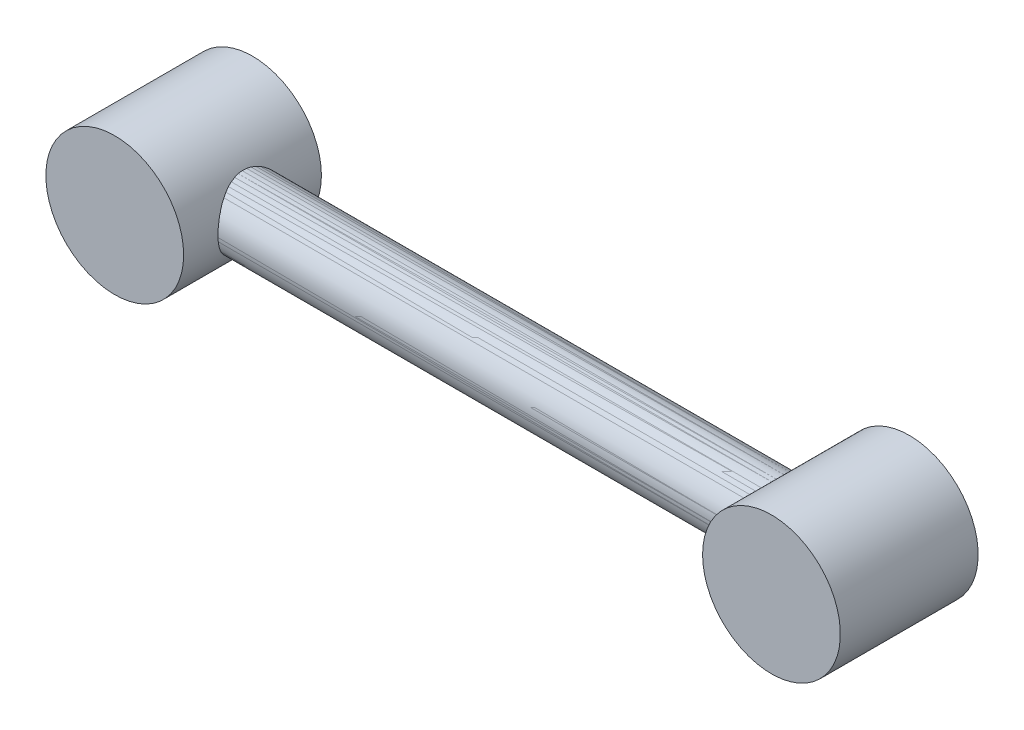
ISO-10303-21;
HEADER;
FILE_DESCRIPTION(('STEP AP214'),'2;1');
FILE_NAME('part.step','',(''),(''),'','','');
FILE_SCHEMA(('AUTOMOTIVE_DESIGN { 1 0 10303 214 1 1 1 1 }'));
ENDSEC;
DATA;
#1=APPLICATION_CONTEXT('core data for automotive mechanical design processes');
#2=APPLICATION_PROTOCOL_DEFINITION('international standard','automotive_design',2000,#1);
#3=PRODUCT_CONTEXT('',#1,'mechanical');
#4=PRODUCT('Part','Part','',(#3));
#5=PRODUCT_RELATED_PRODUCT_CATEGORY('part','',(#4));
#6=PRODUCT_DEFINITION_FORMATION('','',#4);
#7=PRODUCT_DEFINITION_CONTEXT('part definition',#1,'design');
#8=PRODUCT_DEFINITION('design','',#6,#7);
#9=PRODUCT_DEFINITION_SHAPE('','',#8);
#10=(LENGTH_UNIT() NAMED_UNIT(*) SI_UNIT(.MILLI.,.METRE.));
#11=(NAMED_UNIT(*) PLANE_ANGLE_UNIT() SI_UNIT($,.RADIAN.));
#12=(NAMED_UNIT(*) SI_UNIT($,.STERADIAN.) SOLID_ANGLE_UNIT());
#13=UNCERTAINTY_MEASURE_WITH_UNIT(LENGTH_MEASURE(1.E-05),#10,'distance_accuracy_value','');
#14=(GEOMETRIC_REPRESENTATION_CONTEXT(3) GLOBAL_UNCERTAINTY_ASSIGNED_CONTEXT((#13)) GLOBAL_UNIT_ASSIGNED_CONTEXT((#10,
#11,#12)) REPRESENTATION_CONTEXT('',''));
#15=CARTESIAN_POINT('',(0.,0.,0.));
#16=DIRECTION('',(0.,0.,1.));
#17=DIRECTION('',(1.,0.,0.));
#18=AXIS2_PLACEMENT_3D('',#15,#16,#17);
#19=CARTESIAN_POINT('',(87.6660349232078,0.,-10.));
#20=DIRECTION('',(0.,0.,1.));
#21=DIRECTION('',(-1.,0.,0.));
#22=AXIS2_PLACEMENT_3D('',#19,#20,#21);
#23=CYLINDRICAL_SURFACE('',#22,10.);
#24=CARTESIAN_POINT('',(87.6660349232078,0.,-10.));
#25=DIRECTION('',(0.,0.,-1.));
#26=DIRECTION('',(-1.,0.,0.));
#27=AXIS2_PLACEMENT_3D('',#24,#25,#26);
#28=CIRCLE('',#27,10.);
#29=CARTESIAN_POINT('',(77.6660349232078,0.,-10.));
#30=VERTEX_POINT('',#29);
#31=EDGE_CURVE('E11',#30,#30,#28,.T.);
#32=ORIENTED_EDGE('',*,*,#31,.F.);
#33=EDGE_LOOP('',(#32));
#34=FACE_BOUND('',#33,.T.);
#35=CARTESIAN_POINT('',(87.6660349232078,0.,10.));
#36=DIRECTION('',(0.,0.,-1.));
#37=DIRECTION('',(-1.,0.,0.));
#38=AXIS2_PLACEMENT_3D('',#35,#36,#37);
#39=CIRCLE('',#38,10.);
#40=CARTESIAN_POINT('',(77.6660349232078,0.,10.));
#41=VERTEX_POINT('',#40);
#42=EDGE_CURVE('E51',#41,#41,#39,.T.);
#43=ORIENTED_EDGE('',*,*,#42,.T.);
#44=EDGE_LOOP('',(#43));
#45=FACE_BOUND('',#44,.T.);
#46=ADVANCED_FACE('F45',(#34,#45),#23,.T.);
#47=CARTESIAN_POINT('',(87.6660349232078,0.,-10.));
#48=DIRECTION('',(0.,0.,1.));
#49=DIRECTION('',(-1.,0.,0.));
#50=AXIS2_PLACEMENT_3D('',#47,#48,#49);
#51=PLANE('',#50);
#52=ORIENTED_EDGE('',*,*,#31,.T.);
#53=EDGE_LOOP('',(#52));
#54=FACE_BOUND('',#53,.T.);
#55=ADVANCED_FACE('F60',(#54),#51,.F.);
#56=CARTESIAN_POINT('',(87.6660349232078,0.,10.));
#57=DIRECTION('',(0.,0.,1.));
#58=DIRECTION('',(-1.,0.,0.));
#59=AXIS2_PLACEMENT_3D('',#56,#57,#58);
#60=PLANE('',#59);
#61=ORIENTED_EDGE('',*,*,#42,.F.);
#62=EDGE_LOOP('',(#61));
#63=FACE_BOUND('',#62,.T.);
#64=ADVANCED_FACE('F58',(#63),#60,.T.);
#65=CLOSED_SHELL('',(#46,#55,#64));
#66=MANIFOLD_SOLID_BREP('B2',#65);
#67=CARTESIAN_POINT('',(0.,0.,0.));
#68=DIRECTION('',(1.,0.,0.));
#69=DIRECTION('',(0.,0.,1.));
#70=AXIS2_PLACEMENT_3D('',#67,#68,#69);
#71=CYLINDRICAL_SURFACE('',#70,5.);
#72=CARTESIAN_POINT('',(0.,0.,0.));
#73=DIRECTION('',(1.,0.,0.));
#74=DIRECTION('',(0.,0.,-1.));
#75=AXIS2_PLACEMENT_3D('',#72,#73,#74);
#76=CIRCLE('',#75,5.);
#77=CARTESIAN_POINT('',(0.,0.,-5.));
#78=VERTEX_POINT('',#77);
#79=EDGE_CURVE('E44',#78,#78,#76,.T.);
#80=ORIENTED_EDGE('',*,*,#79,.T.);
#81=EDGE_LOOP('',(#80));
#82=FACE_BOUND('',#81,.T.);
#83=CARTESIAN_POINT('',(80.,0.,0.));
#84=DIRECTION('',(1.,0.,0.));
#85=DIRECTION('',(0.,0.,-1.));
#86=AXIS2_PLACEMENT_3D('',#83,#84,#85);
#87=CIRCLE('',#86,5.);
#88=CARTESIAN_POINT('',(80.,0.,-5.));
#89=VERTEX_POINT('',#88);
#90=EDGE_CURVE('E102',#89,#89,#87,.T.);
#91=ORIENTED_EDGE('',*,*,#90,.F.);
#92=EDGE_LOOP('',(#91));
#93=FACE_BOUND('',#92,.T.);
#94=ADVANCED_FACE('F99',(#82,#93),#71,.T.);
#95=CARTESIAN_POINT('',(0.,0.,0.));
#96=DIRECTION('',(-1.,0.,0.));
#97=DIRECTION('',(0.,0.,-1.));
#98=AXIS2_PLACEMENT_3D('',#95,#96,#97);
#99=PLANE('',#98);
#100=ORIENTED_EDGE('',*,*,#79,.F.);
#101=EDGE_LOOP('',(#100));
#102=FACE_BOUND('',#101,.T.);
#103=ADVANCED_FACE('F114',(#102),#99,.T.);
#104=CARTESIAN_POINT('',(80.,0.,0.));
#105=DIRECTION('',(-1.,0.,0.));
#106=DIRECTION('',(0.,0.,-1.));
#107=AXIS2_PLACEMENT_3D('',#104,#105,#106);
#108=PLANE('',#107);
#109=ORIENTED_EDGE('',*,*,#90,.T.);
#110=EDGE_LOOP('',(#109));
#111=FACE_BOUND('',#110,.T.);
#112=ADVANCED_FACE('F111',(#111),#108,.F.);
#113=CLOSED_SHELL('',(#94,#103,#112));
#114=MANIFOLD_SOLID_BREP('B6',#113);
#115=CARTESIAN_POINT('',(-7.66603492320783,0.,-10.));
#116=DIRECTION('',(0.,0.,1.));
#117=DIRECTION('',(1.,0.,0.));
#118=AXIS2_PLACEMENT_3D('',#115,#116,#117);
#119=CYLINDRICAL_SURFACE('',#118,10.);
#120=CARTESIAN_POINT('',(-7.66603492320783,0.,-10.));
#121=DIRECTION('',(0.,0.,1.));
#122=DIRECTION('',(1.,0.,0.));
#123=AXIS2_PLACEMENT_3D('',#120,#121,#122);
#124=CIRCLE('',#123,10.);
#125=CARTESIAN_POINT('',(2.33396507679217,0.,-10.));
#126=VERTEX_POINT('',#125);
#127=EDGE_CURVE('E98',#126,#126,#124,.T.);
#128=ORIENTED_EDGE('',*,*,#127,.T.);
#129=EDGE_LOOP('',(#128));
#130=FACE_BOUND('',#129,.T.);
#131=CARTESIAN_POINT('',(-7.66603492320783,0.,10.));
#132=DIRECTION('',(0.,0.,1.));
#133=DIRECTION('',(1.,0.,0.));
#134=AXIS2_PLACEMENT_3D('',#131,#132,#133);
#135=CIRCLE('',#134,10.);
#136=CARTESIAN_POINT('',(2.33396507679217,0.,10.));
#137=VERTEX_POINT('',#136);
#138=EDGE_CURVE('E158',#137,#137,#135,.T.);
#139=ORIENTED_EDGE('',*,*,#138,.F.);
#140=EDGE_LOOP('',(#139));
#141=FACE_BOUND('',#140,.T.);
#142=ADVANCED_FACE('F152',(#130,#141),#119,.T.);
#143=CARTESIAN_POINT('',(-7.66603492320783,0.,-10.));
#144=DIRECTION('',(0.,0.,1.));
#145=DIRECTION('',(1.,0.,0.));
#146=AXIS2_PLACEMENT_3D('',#143,#144,#145);
#147=PLANE('',#146);
#148=ORIENTED_EDGE('',*,*,#127,.F.);
#149=EDGE_LOOP('',(#148));
#150=FACE_BOUND('',#149,.T.);
#151=ADVANCED_FACE('F167',(#150),#147,.F.);
#152=CARTESIAN_POINT('',(-7.66603492320783,0.,10.));
#153=DIRECTION('',(0.,0.,1.));
#154=DIRECTION('',(1.,0.,0.));
#155=AXIS2_PLACEMENT_3D('',#152,#153,#154);
#156=PLANE('',#155);
#157=ORIENTED_EDGE('',*,*,#138,.T.);
#158=EDGE_LOOP('',(#157));
#159=FACE_BOUND('',#158,.T.);
#160=ADVANCED_FACE('F164',(#159),#156,.T.);
#161=CLOSED_SHELL('',(#142,#151,#160));
#162=MANIFOLD_SOLID_BREP('B39',#161);
#163=CARTESIAN_POINT('',(80.,0.,0.));
#164=DIRECTION('',(-1.,0.,0.));
#165=DIRECTION('',(0.,0.,1.));
#166=AXIS2_PLACEMENT_3D('',#163,#164,#165);
#167=CYLINDRICAL_SURFACE('',#166,5.);
#168=CARTESIAN_POINT('',(80.,0.,0.));
#169=DIRECTION('',(1.,0.,0.));
#170=DIRECTION('',(0.,0.,-1.));
#171=AXIS2_PLACEMENT_3D('',#168,#169,#170);
#172=CIRCLE('',#171,5.);
#173=CARTESIAN_POINT('',(80.,0.,-5.));
#174=VERTEX_POINT('',#173);
#175=EDGE_CURVE('E151',#174,#174,#172,.T.);
#176=ORIENTED_EDGE('',*,*,#175,.F.);
#177=EDGE_LOOP('',(#176));
#178=FACE_BOUND('',#177,.T.);
#179=CARTESIAN_POINT('',(0.,0.,0.));
#180=DIRECTION('',(1.,0.,0.));
#181=DIRECTION('',(0.,0.,-1.));
#182=AXIS2_PLACEMENT_3D('',#179,#180,#181);
#183=CIRCLE('',#182,5.);
#184=CARTESIAN_POINT('',(0.,0.,-5.));
#185=VERTEX_POINT('',#184);
#186=EDGE_CURVE('E201',#185,#185,#183,.T.);
#187=ORIENTED_EDGE('',*,*,#186,.T.);
#188=EDGE_LOOP('',(#187));
#189=FACE_BOUND('',#188,.T.);
#190=ADVANCED_FACE('F198',(#178,#189),#167,.T.);
#191=CARTESIAN_POINT('',(80.,0.,0.));
#192=DIRECTION('',(1.,0.,0.));
#193=DIRECTION('',(0.,0.,-1.));
#194=AXIS2_PLACEMENT_3D('',#191,#192,#193);
#195=PLANE('',#194);
#196=ORIENTED_EDGE('',*,*,#175,.T.);
#197=EDGE_LOOP('',(#196));
#198=FACE_BOUND('',#197,.T.);
#199=ADVANCED_FACE('F213',(#198),#195,.T.);
#200=CARTESIAN_POINT('',(0.,0.,0.));
#201=DIRECTION('',(1.,0.,0.));
#202=DIRECTION('',(0.,0.,-1.));
#203=AXIS2_PLACEMENT_3D('',#200,#201,#202);
#204=PLANE('',#203);
#205=ORIENTED_EDGE('',*,*,#186,.F.);
#206=EDGE_LOOP('',(#205));
#207=FACE_BOUND('',#206,.T.);
#208=ADVANCED_FACE('F211',(#207),#204,.F.);
#209=CLOSED_SHELL('',(#190,#199,#208));
#210=MANIFOLD_SOLID_BREP('B93',#209);
#211=ADVANCED_BREP_SHAPE_REPRESENTATION('',(#18,#66,#114,#162,#210),#14);
#212=SHAPE_DEFINITION_REPRESENTATION(#9,#211);
ENDSEC;
END-ISO-10303-21;
